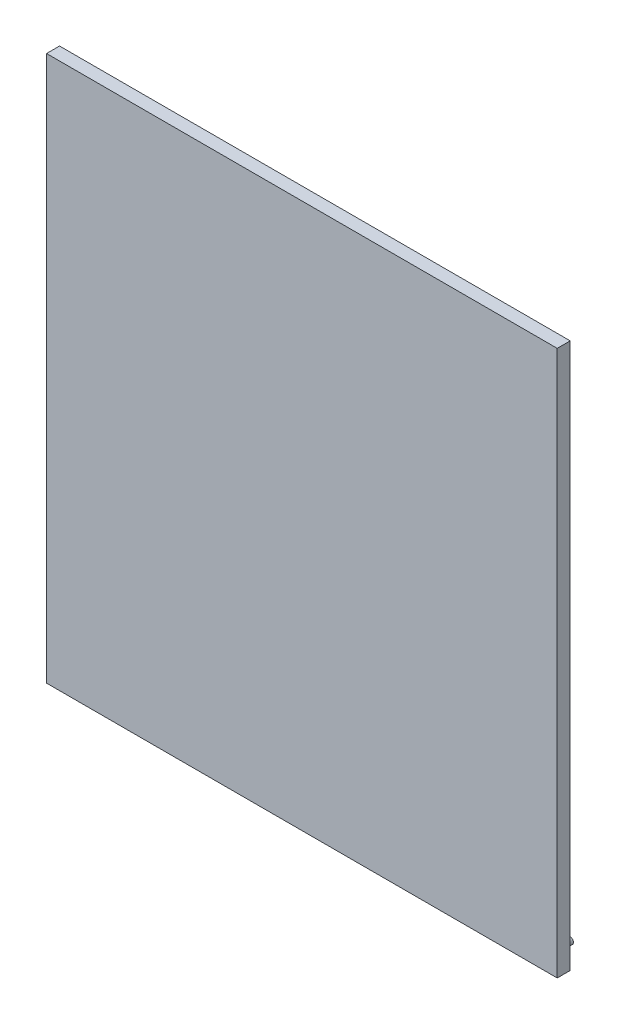
ISO-10303-21;
HEADER;
FILE_DESCRIPTION(('STEP AP214'),'2;1');
FILE_NAME('part.step','',(''),(''),'','','');
FILE_SCHEMA(('AUTOMOTIVE_DESIGN { 1 0 10303 214 1 1 1 1 }'));
ENDSEC;
DATA;
#1=APPLICATION_CONTEXT('core data for automotive mechanical design processes');
#2=APPLICATION_PROTOCOL_DEFINITION('international standard','automotive_design',2000,#1);
#3=PRODUCT_CONTEXT('',#1,'mechanical');
#4=PRODUCT('Part','Part','',(#3));
#5=PRODUCT_RELATED_PRODUCT_CATEGORY('part','',(#4));
#6=PRODUCT_DEFINITION_FORMATION('','',#4);
#7=PRODUCT_DEFINITION_CONTEXT('part definition',#1,'design');
#8=PRODUCT_DEFINITION('design','',#6,#7);
#9=PRODUCT_DEFINITION_SHAPE('','',#8);
#10=(LENGTH_UNIT() NAMED_UNIT(*) SI_UNIT(.MILLI.,.METRE.));
#11=(NAMED_UNIT(*) PLANE_ANGLE_UNIT() SI_UNIT($,.RADIAN.));
#12=(NAMED_UNIT(*) SI_UNIT($,.STERADIAN.) SOLID_ANGLE_UNIT());
#13=UNCERTAINTY_MEASURE_WITH_UNIT(LENGTH_MEASURE(1.E-05),#10,'distance_accuracy_value','');
#14=(GEOMETRIC_REPRESENTATION_CONTEXT(3) GLOBAL_UNCERTAINTY_ASSIGNED_CONTEXT((#13)) GLOBAL_UNIT_ASSIGNED_CONTEXT((#10,
#11,#12)) REPRESENTATION_CONTEXT('',''));
#15=CARTESIAN_POINT('',(0.,0.,0.));
#16=DIRECTION('',(0.,0.,1.));
#17=DIRECTION('',(1.,0.,0.));
#18=AXIS2_PLACEMENT_3D('',#15,#16,#17);
#19=CARTESIAN_POINT('',(0.,0.,30.));
#20=DIRECTION('',(-1.,0.,0.));
#21=DIRECTION('',(0.,0.,1.));
#22=AXIS2_PLACEMENT_3D('',#19,#20,#21);
#23=PLANE('',#22);
#24=DIRECTION('',(0.,1.,0.));
#25=VECTOR('',#24,1.);
#26=CARTESIAN_POINT('',(0.,0.,0.));
#27=LINE('',#26,#25);
#28=CARTESIAN_POINT('',(0.,0.,0.));
#29=VERTEX_POINT('',#28);
#30=CARTESIAN_POINT('',(0.,1260.,0.));
#31=VERTEX_POINT('',#30);
#32=EDGE_CURVE('E97',#29,#31,#27,.T.);
#33=ORIENTED_EDGE('',*,*,#32,.F.);
#34=DIRECTION('',(0.,0.,-1.));
#35=VECTOR('',#34,1.);
#36=CARTESIAN_POINT('',(0.,0.,30.));
#37=LINE('',#36,#35);
#38=CARTESIAN_POINT('',(0.,0.,30.));
#39=VERTEX_POINT('',#38);
#40=EDGE_CURVE('E11',#39,#29,#37,.T.);
#41=ORIENTED_EDGE('',*,*,#40,.F.);
#42=DIRECTION('',(0.,1.,0.));
#43=VECTOR('',#42,1.);
#44=CARTESIAN_POINT('',(0.,0.,30.));
#45=LINE('',#44,#43);
#46=CARTESIAN_POINT('',(0.,1260.,30.));
#47=VERTEX_POINT('',#46);
#48=EDGE_CURVE('E90',#39,#47,#45,.T.);
#49=ORIENTED_EDGE('',*,*,#48,.T.);
#50=DIRECTION('',(0.,0.,-1.));
#51=VECTOR('',#50,1.);
#52=CARTESIAN_POINT('',(0.,1260.,30.));
#53=LINE('',#52,#51);
#54=EDGE_CURVE('E35',#47,#31,#53,.T.);
#55=ORIENTED_EDGE('',*,*,#54,.T.);
#56=EDGE_LOOP('',(#33,#41,#49,#55));
#57=FACE_BOUND('',#56,.T.);
#58=ADVANCED_FACE('F32',(#57),#23,.T.);
#59=CARTESIAN_POINT('',(1180.,-1.50086238093717E-13,30.));
#60=DIRECTION('',(0.,-1.,0.));
#61=DIRECTION('',(1.,0.,0.));
#62=AXIS2_PLACEMENT_3D('',#59,#60,#61);
#63=PLANE('',#62);
#64=DIRECTION('',(-1.,0.,0.));
#65=VECTOR('',#64,1.);
#66=CARTESIAN_POINT('',(1180.,-1.50086238093717E-13,0.));
#67=LINE('',#66,#65);
#68=CARTESIAN_POINT('',(1180.,-1.50086238093717E-13,0.));
#69=VERTEX_POINT('',#68);
#70=EDGE_CURVE('E92',#69,#29,#67,.T.);
#71=ORIENTED_EDGE('',*,*,#70,.F.);
#72=DIRECTION('',(0.,0.,-1.));
#73=VECTOR('',#72,1.);
#74=CARTESIAN_POINT('',(1180.,-1.50086238093717E-13,30.));
#75=LINE('',#74,#73);
#76=CARTESIAN_POINT('',(1180.,-1.50086238093717E-13,30.));
#77=VERTEX_POINT('',#76);
#78=EDGE_CURVE('E41',#77,#69,#75,.T.);
#79=ORIENTED_EDGE('',*,*,#78,.F.);
#80=DIRECTION('',(-1.,0.,0.));
#81=VECTOR('',#80,1.);
#82=CARTESIAN_POINT('',(1180.,-1.50086238093717E-13,30.));
#83=LINE('',#82,#81);
#84=EDGE_CURVE('E87',#77,#39,#83,.T.);
#85=ORIENTED_EDGE('',*,*,#84,.T.);
#86=ORIENTED_EDGE('',*,*,#40,.T.);
#87=EDGE_LOOP('',(#71,#79,#85,#86));
#88=FACE_BOUND('',#87,.T.);
#89=ADVANCED_FACE('F108',(#88),#63,.T.);
#90=CARTESIAN_POINT('',(1180.,1260.,30.));
#91=DIRECTION('',(1.,0.,0.));
#92=DIRECTION('',(0.,1.,0.));
#93=AXIS2_PLACEMENT_3D('',#90,#91,#92);
#94=PLANE('',#93);
#95=DIRECTION('',(0.,-1.,0.));
#96=VECTOR('',#95,1.);
#97=CARTESIAN_POINT('',(1180.,1260.,0.));
#98=LINE('',#97,#96);
#99=CARTESIAN_POINT('',(1180.,1260.,0.));
#100=VERTEX_POINT('',#99);
#101=EDGE_CURVE('E82',#100,#69,#98,.T.);
#102=ORIENTED_EDGE('',*,*,#101,.F.);
#103=DIRECTION('',(0.,0.,-1.));
#104=VECTOR('',#103,1.);
#105=CARTESIAN_POINT('',(1180.,1260.,30.));
#106=LINE('',#105,#104);
#107=CARTESIAN_POINT('',(1180.,1260.,30.));
#108=VERTEX_POINT('',#107);
#109=EDGE_CURVE('E77',#108,#100,#106,.T.);
#110=ORIENTED_EDGE('',*,*,#109,.F.);
#111=DIRECTION('',(0.,-1.,0.));
#112=VECTOR('',#111,1.);
#113=CARTESIAN_POINT('',(1180.,1260.,30.));
#114=LINE('',#113,#112);
#115=EDGE_CURVE('E80',#108,#77,#114,.T.);
#116=ORIENTED_EDGE('',*,*,#115,.T.);
#117=ORIENTED_EDGE('',*,*,#78,.T.);
#118=EDGE_LOOP('',(#102,#110,#116,#117));
#119=FACE_BOUND('',#118,.T.);
#120=ADVANCED_FACE('F79',(#119),#94,.T.);
#121=CARTESIAN_POINT('',(0.,1260.,30.));
#122=DIRECTION('',(0.,1.,0.));
#123=DIRECTION('',(0.,0.,1.));
#124=AXIS2_PLACEMENT_3D('',#121,#122,#123);
#125=PLANE('',#124);
#126=DIRECTION('',(1.,0.,0.));
#127=VECTOR('',#126,1.);
#128=CARTESIAN_POINT('',(0.,1260.,0.));
#129=LINE('',#128,#127);
#130=EDGE_CURVE('E100',#31,#100,#129,.T.);
#131=ORIENTED_EDGE('',*,*,#130,.F.);
#132=ORIENTED_EDGE('',*,*,#54,.F.);
#133=DIRECTION('',(1.,0.,0.));
#134=VECTOR('',#133,1.);
#135=CARTESIAN_POINT('',(0.,1260.,30.));
#136=LINE('',#135,#134);
#137=EDGE_CURVE('E86',#47,#108,#136,.T.);
#138=ORIENTED_EDGE('',*,*,#137,.T.);
#139=ORIENTED_EDGE('',*,*,#109,.T.);
#140=EDGE_LOOP('',(#131,#132,#138,#139));
#141=FACE_BOUND('',#140,.T.);
#142=ADVANCED_FACE('F89',(#141),#125,.T.);
#143=CARTESIAN_POINT('',(0.,0.,30.));
#144=DIRECTION('',(0.,0.,-1.));
#145=DIRECTION('',(-1.,0.,0.));
#146=AXIS2_PLACEMENT_3D('',#143,#144,#145);
#147=PLANE('',#146);
#148=ORIENTED_EDGE('',*,*,#48,.F.);
#149=ORIENTED_EDGE('',*,*,#84,.F.);
#150=ORIENTED_EDGE('',*,*,#115,.F.);
#151=ORIENTED_EDGE('',*,*,#137,.F.);
#152=EDGE_LOOP('',(#148,#149,#150,#151));
#153=FACE_BOUND('',#152,.T.);
#154=ADVANCED_FACE('F85',(#153),#147,.F.);
#155=CARTESIAN_POINT('',(0.,0.,0.));
#156=DIRECTION('',(0.,0.,-1.));
#157=DIRECTION('',(-1.,0.,0.));
#158=AXIS2_PLACEMENT_3D('',#155,#156,#157);
#159=PLANE('',#158);
#160=CARTESIAN_POINT('',(1150.,29.9999999999998,0.));
#161=DIRECTION('',(0.,0.,-1.));
#162=DIRECTION('',(-1.,0.,0.));
#163=AXIS2_PLACEMENT_3D('',#160,#161,#162);
#164=CIRCLE('',#163,7.49999999999997);
#165=CARTESIAN_POINT('',(1142.5,29.9999999999998,0.));
#166=VERTEX_POINT('',#165);
#167=EDGE_CURVE('E150',#166,#166,#164,.T.);
#168=ORIENTED_EDGE('',*,*,#167,.F.);
#169=EDGE_LOOP('',(#168));
#170=FACE_BOUND('',#169,.T.);
#171=CARTESIAN_POINT('',(30.,29.9999999999999,0.));
#172=DIRECTION('',(0.,0.,-1.));
#173=DIRECTION('',(-1.,0.,0.));
#174=AXIS2_PLACEMENT_3D('',#171,#172,#173);
#175=CIRCLE('',#174,7.5);
#176=CARTESIAN_POINT('',(22.5,29.9999999999999,0.));
#177=VERTEX_POINT('',#176);
#178=EDGE_CURVE('E151',#177,#177,#175,.T.);
#179=ORIENTED_EDGE('',*,*,#178,.F.);
#180=EDGE_LOOP('',(#179));
#181=FACE_BOUND('',#180,.T.);
#182=ORIENTED_EDGE('',*,*,#32,.T.);
#183=ORIENTED_EDGE('',*,*,#130,.T.);
#184=ORIENTED_EDGE('',*,*,#101,.T.);
#185=ORIENTED_EDGE('',*,*,#70,.T.);
#186=EDGE_LOOP('',(#182,#183,#184,#185));
#187=FACE_BOUND('',#186,.T.);
#188=ADVANCED_FACE('F107',(#170,#181,#187),#159,.T.);
#189=CARTESIAN_POINT('',(30.,29.9999999999999,-30.));
#190=DIRECTION('',(0.,0.,1.));
#191=DIRECTION('',(1.,0.,0.));
#192=AXIS2_PLACEMENT_3D('',#189,#190,#191);
#193=CYLINDRICAL_SURFACE('',#192,7.5);
#194=CARTESIAN_POINT('',(30.,29.9999999999999,-30.));
#195=DIRECTION('',(0.,0.,-1.));
#196=DIRECTION('',(-1.,0.,0.));
#197=AXIS2_PLACEMENT_3D('',#194,#195,#196);
#198=CIRCLE('',#197,7.5);
#199=CARTESIAN_POINT('',(22.5,29.9999999999999,-30.));
#200=VERTEX_POINT('',#199);
#201=EDGE_CURVE('E101',#200,#200,#198,.T.);
#202=ORIENTED_EDGE('',*,*,#201,.F.);
#203=EDGE_LOOP('',(#202));
#204=FACE_BOUND('',#203,.T.);
#205=ORIENTED_EDGE('',*,*,#178,.T.);
#206=EDGE_LOOP('',(#205));
#207=FACE_BOUND('',#206,.T.);
#208=ADVANCED_FACE('F125',(#204,#207),#193,.T.);
#209=CARTESIAN_POINT('',(30.,29.9999999999999,-30.));
#210=DIRECTION('',(0.,0.,-1.));
#211=DIRECTION('',(-1.,0.,0.));
#212=AXIS2_PLACEMENT_3D('',#209,#210,#211);
#213=PLANE('',#212);
#214=ORIENTED_EDGE('',*,*,#201,.T.);
#215=EDGE_LOOP('',(#214));
#216=FACE_BOUND('',#215,.T.);
#217=ADVANCED_FACE('F130',(#216),#213,.T.);
#218=CARTESIAN_POINT('',(1150.,29.9999999999998,-30.));
#219=DIRECTION('',(0.,0.,1.));
#220=DIRECTION('',(1.,0.,0.));
#221=AXIS2_PLACEMENT_3D('',#218,#219,#220);
#222=CYLINDRICAL_SURFACE('',#221,7.49999999999997);
#223=CARTESIAN_POINT('',(1150.,29.9999999999998,-30.));
#224=DIRECTION('',(0.,0.,-1.));
#225=DIRECTION('',(-1.,0.,0.));
#226=AXIS2_PLACEMENT_3D('',#223,#224,#225);
#227=CIRCLE('',#226,7.49999999999997);
#228=CARTESIAN_POINT('',(1142.5,29.9999999999998,-30.));
#229=VERTEX_POINT('',#228);
#230=EDGE_CURVE('E147',#229,#229,#227,.T.);
#231=ORIENTED_EDGE('',*,*,#230,.F.);
#232=EDGE_LOOP('',(#231));
#233=FACE_BOUND('',#232,.T.);
#234=ORIENTED_EDGE('',*,*,#167,.T.);
#235=EDGE_LOOP('',(#234));
#236=FACE_BOUND('',#235,.T.);
#237=ADVANCED_FACE('F134',(#233,#236),#222,.T.);
#238=CARTESIAN_POINT('',(1150.,29.9999999999998,-30.));
#239=DIRECTION('',(0.,0.,-1.));
#240=DIRECTION('',(-1.,0.,0.));
#241=AXIS2_PLACEMENT_3D('',#238,#239,#240);
#242=PLANE('',#241);
#243=ORIENTED_EDGE('',*,*,#230,.T.);
#244=EDGE_LOOP('',(#243));
#245=FACE_BOUND('',#244,.T.);
#246=ADVANCED_FACE('F136',(#245),#242,.T.);
#247=CLOSED_SHELL('',(#58,#89,#120,#142,#154,#188,#208,#217,#237,#246));
#248=MANIFOLD_SOLID_BREP('B2',#247);
#249=ADVANCED_BREP_SHAPE_REPRESENTATION('',(#18,#248),#14);
#250=SHAPE_DEFINITION_REPRESENTATION(#9,#249);
ENDSEC;
END-ISO-10303-21;
